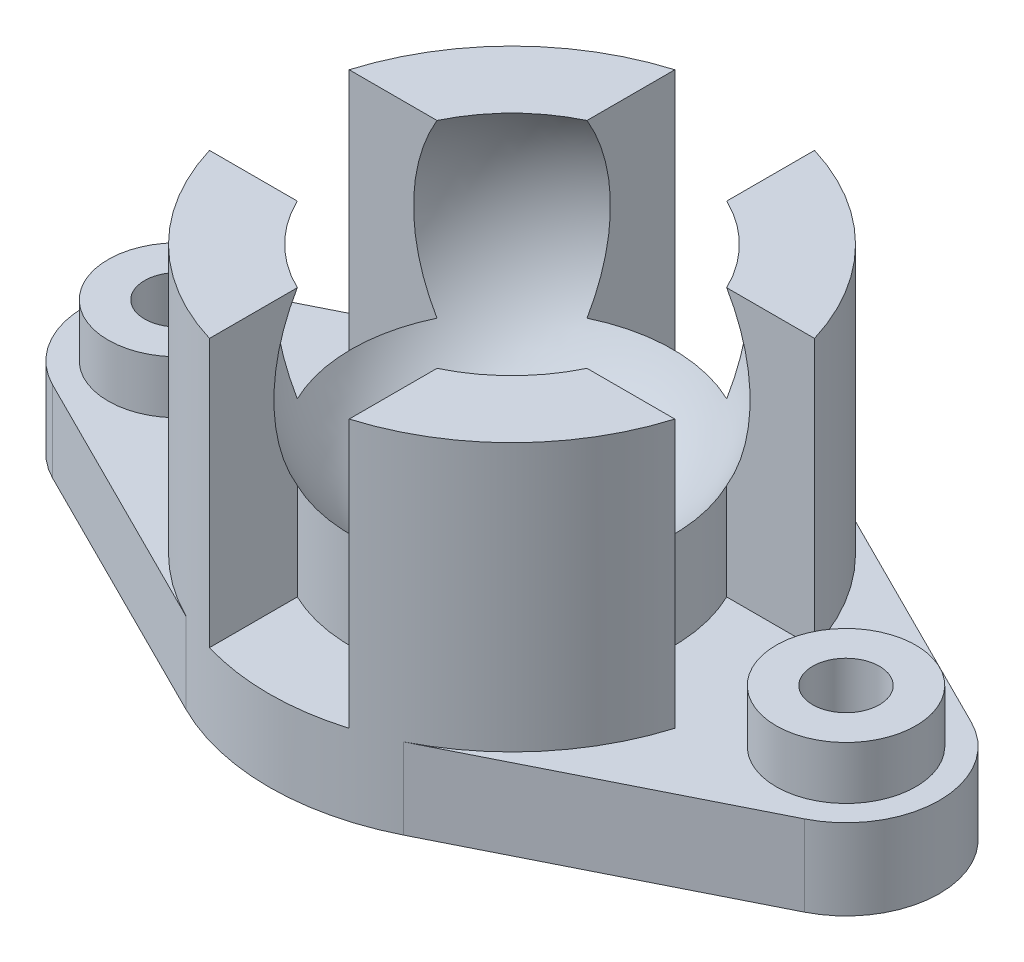
ISO-10303-21;
HEADER;
FILE_DESCRIPTION(('STEP AP214'),'2;1');
FILE_NAME('part.step','',(''),(''),'','','');
FILE_SCHEMA(('AUTOMOTIVE_DESIGN { 1 0 10303 214 1 1 1 1 }'));
ENDSEC;
DATA;
#1=APPLICATION_CONTEXT('core data for automotive mechanical design processes');
#2=APPLICATION_PROTOCOL_DEFINITION('international standard','automotive_design',2000,#1);
#3=PRODUCT_CONTEXT('',#1,'mechanical');
#4=PRODUCT('Part','Part','',(#3));
#5=PRODUCT_RELATED_PRODUCT_CATEGORY('part','',(#4));
#6=PRODUCT_DEFINITION_FORMATION('','',#4);
#7=PRODUCT_DEFINITION_CONTEXT('part definition',#1,'design');
#8=PRODUCT_DEFINITION('design','',#6,#7);
#9=PRODUCT_DEFINITION_SHAPE('','',#8);
#10=(LENGTH_UNIT() NAMED_UNIT(*) SI_UNIT(.MILLI.,.METRE.));
#11=(NAMED_UNIT(*) PLANE_ANGLE_UNIT() SI_UNIT($,.RADIAN.));
#12=(NAMED_UNIT(*) SI_UNIT($,.STERADIAN.) SOLID_ANGLE_UNIT());
#13=UNCERTAINTY_MEASURE_WITH_UNIT(LENGTH_MEASURE(1.E-05),#10,'distance_accuracy_value','');
#14=(GEOMETRIC_REPRESENTATION_CONTEXT(3) GLOBAL_UNCERTAINTY_ASSIGNED_CONTEXT((#13)) GLOBAL_UNIT_ASSIGNED_CONTEXT((#10,
#11,#12)) REPRESENTATION_CONTEXT('',''));
#15=CARTESIAN_POINT('',(0.,0.,0.));
#16=DIRECTION('',(0.,0.,1.));
#17=DIRECTION('',(1.,0.,0.));
#18=AXIS2_PLACEMENT_3D('',#15,#16,#17);
#19=CARTESIAN_POINT('',(0.,2.66,0.));
#20=DIRECTION('',(0.,-1.,0.));
#21=DIRECTION('',(0.,0.,-1.));
#22=AXIS2_PLACEMENT_3D('',#19,#20,#21);
#23=CYLINDRICAL_SURFACE('',#22,8.);
#24=DIRECTION('',(0.,1.,0.));
#25=VECTOR('',#24,1.);
#26=CARTESIAN_POINT('',(2.3,2.66,-7.66224510179621));
#27=LINE('',#26,#25);
#28=CARTESIAN_POINT('',(2.3,2.66,-7.66224510179621));
#29=VERTEX_POINT('',#28);
#30=CARTESIAN_POINT('',(2.3,11.48,-7.66224510179621));
#31=VERTEX_POINT('',#30);
#32=EDGE_CURVE('E231',#29,#31,#27,.T.);
#33=ORIENTED_EDGE('',*,*,#32,.T.);
#34=CARTESIAN_POINT('',(0.,11.48,0.));
#35=DIRECTION('',(0.,1.,0.));
#36=DIRECTION('',(0.,0.,1.));
#37=AXIS2_PLACEMENT_3D('',#34,#35,#36);
#38=CIRCLE('',#37,8.);
#39=CARTESIAN_POINT('',(7.66224510179621,11.48,-2.3));
#40=VERTEX_POINT('',#39);
#41=EDGE_CURVE('E388',#40,#31,#38,.T.);
#42=ORIENTED_EDGE('',*,*,#41,.F.);
#43=DIRECTION('',(0.,1.,0.));
#44=VECTOR('',#43,1.);
#45=CARTESIAN_POINT('',(7.66224510179621,2.66,-2.3));
#46=LINE('',#45,#44);
#47=CARTESIAN_POINT('',(7.66224510179621,2.66,-2.3));
#48=VERTEX_POINT('',#47);
#49=EDGE_CURVE('E311',#48,#40,#46,.T.);
#50=ORIENTED_EDGE('',*,*,#49,.F.);
#51=CARTESIAN_POINT('',(0.,2.66,0.));
#52=DIRECTION('',(0.,1.,0.));
#53=DIRECTION('',(0.,0.,1.));
#54=AXIS2_PLACEMENT_3D('',#51,#52,#53);
#55=CIRCLE('',#54,8.);
#56=CARTESIAN_POINT('',(3.58029256966229,2.66,-7.15412504193357));
#57=VERTEX_POINT('',#56);
#58=EDGE_CURVE('E390',#57,#48,#55,.F.);
#59=ORIENTED_EDGE('',*,*,#58,.F.);
#60=DIRECTION('',(0.,-1.,0.));
#61=VECTOR('',#60,1.);
#62=CARTESIAN_POINT('',(3.58029256966229,2.66,-7.15412504193357));
#63=LINE('',#62,#61);
#64=CARTESIAN_POINT('',(3.58029256966229,0.,-7.15412504193357));
#65=VERTEX_POINT('',#64);
#66=EDGE_CURVE('E464',#57,#65,#63,.T.);
#67=ORIENTED_EDGE('',*,*,#66,.T.);
#68=CARTESIAN_POINT('',(0.,0.,0.));
#69=DIRECTION('',(0.,1.,0.));
#70=DIRECTION('',(0.,0.,1.));
#71=AXIS2_PLACEMENT_3D('',#68,#69,#70);
#72=CIRCLE('',#71,8.);
#73=CARTESIAN_POINT('',(-3.58029256966229,0.,-7.15412504193357));
#74=VERTEX_POINT('',#73);
#75=EDGE_CURVE('E420',#65,#74,#72,.T.);
#76=ORIENTED_EDGE('',*,*,#75,.T.);
#77=DIRECTION('',(0.,-1.,0.));
#78=VECTOR('',#77,1.);
#79=CARTESIAN_POINT('',(-3.58029256966229,2.66,-7.15412504193357));
#80=LINE('',#79,#78);
#81=CARTESIAN_POINT('',(-3.58029256966229,2.66,-7.15412504193357));
#82=VERTEX_POINT('',#81);
#83=EDGE_CURVE('E437',#82,#74,#80,.T.);
#84=ORIENTED_EDGE('',*,*,#83,.F.);
#85=CARTESIAN_POINT('',(-7.66224510179621,2.66,-2.3));
#86=VERTEX_POINT('',#85);
#87=EDGE_CURVE('E394',#86,#82,#55,.F.);
#88=ORIENTED_EDGE('',*,*,#87,.F.);
#89=DIRECTION('',(0.,1.,0.));
#90=VECTOR('',#89,1.);
#91=CARTESIAN_POINT('',(-7.66224510179621,2.66,-2.3));
#92=LINE('',#91,#90);
#93=CARTESIAN_POINT('',(-7.66224510179621,11.48,-2.3));
#94=VERTEX_POINT('',#93);
#95=EDGE_CURVE('E373',#86,#94,#92,.T.);
#96=ORIENTED_EDGE('',*,*,#95,.T.);
#97=CARTESIAN_POINT('',(-2.3,11.48,-7.66224510179621));
#98=VERTEX_POINT('',#97);
#99=EDGE_CURVE('E579',#98,#94,#38,.T.);
#100=ORIENTED_EDGE('',*,*,#99,.F.);
#101=DIRECTION('',(0.,1.,0.));
#102=VECTOR('',#101,1.);
#103=CARTESIAN_POINT('',(-2.3,2.66,-7.66224510179621));
#104=LINE('',#103,#102);
#105=CARTESIAN_POINT('',(-2.3,2.66,-7.66224510179621));
#106=VERTEX_POINT('',#105);
#107=EDGE_CURVE('E244',#106,#98,#104,.T.);
#108=ORIENTED_EDGE('',*,*,#107,.F.);
#109=CARTESIAN_POINT('',(0.,2.66,0.));
#110=DIRECTION('',(0.,1.,0.));
#111=DIRECTION('',(0.,0.,1.));
#112=AXIS2_PLACEMENT_3D('',#109,#110,#111);
#113=CIRCLE('',#112,8.);
#114=EDGE_CURVE('E252',#29,#106,#113,.T.);
#115=ORIENTED_EDGE('',*,*,#114,.F.);
#116=EDGE_LOOP('',(#33,#42,#50,#59,#67,#76,#84,#88,#96,#100,#108,#115));
#117=FACE_BOUND('',#116,.T.);
#118=ADVANCED_FACE('F46',(#117),#23,.T.);
#119=DIRECTION('',(0.,1.,0.));
#120=VECTOR('',#119,1.);
#121=CARTESIAN_POINT('',(7.66224510179621,2.66,2.3));
#122=LINE('',#121,#120);
#123=CARTESIAN_POINT('',(7.66224510179621,2.66,2.3));
#124=VERTEX_POINT('',#123);
#125=CARTESIAN_POINT('',(7.66224510179621,11.48,2.3));
#126=VERTEX_POINT('',#125);
#127=EDGE_CURVE('E295',#124,#126,#122,.T.);
#128=ORIENTED_EDGE('',*,*,#127,.T.);
#129=CARTESIAN_POINT('',(2.3,11.48,7.66224510179621));
#130=VERTEX_POINT('',#129);
#131=EDGE_CURVE('E383',#130,#126,#38,.T.);
#132=ORIENTED_EDGE('',*,*,#131,.F.);
#133=DIRECTION('',(0.,1.,0.));
#134=VECTOR('',#133,1.);
#135=CARTESIAN_POINT('',(2.3,2.66,7.66224510179621));
#136=LINE('',#135,#134);
#137=CARTESIAN_POINT('',(2.3,2.66,7.66224510179621));
#138=VERTEX_POINT('',#137);
#139=EDGE_CURVE('E346',#138,#130,#136,.T.);
#140=ORIENTED_EDGE('',*,*,#139,.F.);
#141=CARTESIAN_POINT('',(0.,2.66,0.));
#142=DIRECTION('',(0.,1.,0.));
#143=DIRECTION('',(0.,0.,1.));
#144=AXIS2_PLACEMENT_3D('',#141,#142,#143);
#145=CIRCLE('',#144,8.);
#146=CARTESIAN_POINT('',(-2.3,2.66,7.66224510179621));
#147=VERTEX_POINT('',#146);
#148=EDGE_CURVE('E320',#147,#138,#145,.T.);
#149=ORIENTED_EDGE('',*,*,#148,.F.);
#150=DIRECTION('',(0.,1.,0.));
#151=VECTOR('',#150,1.);
#152=CARTESIAN_POINT('',(-2.3,2.66,7.66224510179621));
#153=LINE('',#152,#151);
#154=CARTESIAN_POINT('',(-2.3,11.48,7.66224510179621));
#155=VERTEX_POINT('',#154);
#156=EDGE_CURVE('E331',#147,#155,#153,.T.);
#157=ORIENTED_EDGE('',*,*,#156,.T.);
#158=CARTESIAN_POINT('',(-7.66224510179621,11.48,2.3));
#159=VERTEX_POINT('',#158);
#160=EDGE_CURVE('E389',#159,#155,#38,.T.);
#161=ORIENTED_EDGE('',*,*,#160,.F.);
#162=DIRECTION('',(0.,1.,0.));
#163=VECTOR('',#162,1.);
#164=CARTESIAN_POINT('',(-7.66224510179621,2.66,2.3));
#165=LINE('',#164,#163);
#166=CARTESIAN_POINT('',(-7.66224510179621,2.66,2.3));
#167=VERTEX_POINT('',#166);
#168=EDGE_CURVE('E336',#167,#159,#165,.T.);
#169=ORIENTED_EDGE('',*,*,#168,.F.);
#170=CARTESIAN_POINT('',(-3.58029256966229,2.66,7.15412504193357));
#171=VERTEX_POINT('',#170);
#172=EDGE_CURVE('E395',#171,#167,#55,.F.);
#173=ORIENTED_EDGE('',*,*,#172,.F.);
#174=DIRECTION('',(0.,-1.,0.));
#175=VECTOR('',#174,1.);
#176=CARTESIAN_POINT('',(-3.58029256966229,2.66,7.15412504193357));
#177=LINE('',#176,#175);
#178=CARTESIAN_POINT('',(-3.58029256966229,0.,7.15412504193357));
#179=VERTEX_POINT('',#178);
#180=EDGE_CURVE('E477',#171,#179,#177,.T.);
#181=ORIENTED_EDGE('',*,*,#180,.T.);
#182=CARTESIAN_POINT('',(3.58029256966229,0.,7.15412504193357));
#183=VERTEX_POINT('',#182);
#184=EDGE_CURVE('E447',#179,#183,#72,.T.);
#185=ORIENTED_EDGE('',*,*,#184,.T.);
#186=DIRECTION('',(0.,-1.,0.));
#187=VECTOR('',#186,1.);
#188=CARTESIAN_POINT('',(3.58029256966229,2.66,7.15412504193357));
#189=LINE('',#188,#187);
#190=CARTESIAN_POINT('',(3.58029256966229,2.66,7.15412504193357));
#191=VERTEX_POINT('',#190);
#192=EDGE_CURVE('E474',#191,#183,#189,.T.);
#193=ORIENTED_EDGE('',*,*,#192,.F.);
#194=EDGE_CURVE('E387',#124,#191,#55,.F.);
#195=ORIENTED_EDGE('',*,*,#194,.F.);
#196=EDGE_LOOP('',(#128,#132,#140,#149,#157,#161,#169,#173,#181,#185,#193,#195));
#197=FACE_BOUND('',#196,.T.);
#198=ADVANCED_FACE('F559',(#197),#23,.T.);
#199=CARTESIAN_POINT('',(0.,11.48,0.));
#200=DIRECTION('',(0.,1.,0.));
#201=DIRECTION('',(0.,0.,1.));
#202=AXIS2_PLACEMENT_3D('',#199,#200,#201);
#203=PLANE('',#202);
#204=ORIENTED_EDGE('',*,*,#41,.T.);
#205=DIRECTION('',(0.,0.,1.));
#206=VECTOR('',#205,1.);
#207=CARTESIAN_POINT('',(2.3,11.48,0.));
#208=LINE('',#207,#206);
#209=CARTESIAN_POINT('',(2.3,11.48,-4.77049263703446));
#210=VERTEX_POINT('',#209);
#211=EDGE_CURVE('E238',#31,#210,#208,.T.);
#212=ORIENTED_EDGE('',*,*,#211,.T.);
#213=CARTESIAN_POINT('',(0.,11.48,0.));
#214=DIRECTION('',(0.,1.,0.));
#215=DIRECTION('',(0.,0.,1.));
#216=AXIS2_PLACEMENT_3D('',#213,#214,#215);
#217=CIRCLE('',#216,5.29599848942576);
#218=CARTESIAN_POINT('',(4.77049263703446,11.48,-2.3));
#219=VERTEX_POINT('',#218);
#220=EDGE_CURVE('E534',#210,#219,#217,.F.);
#221=ORIENTED_EDGE('',*,*,#220,.T.);
#222=DIRECTION('',(1.,0.,0.));
#223=VECTOR('',#222,1.);
#224=CARTESIAN_POINT('',(0.,11.48,-2.3));
#225=LINE('',#224,#223);
#226=EDGE_CURVE('E288',#219,#40,#225,.T.);
#227=ORIENTED_EDGE('',*,*,#226,.T.);
#228=EDGE_LOOP('',(#204,#212,#221,#227));
#229=FACE_BOUND('',#228,.T.);
#230=ADVANCED_FACE('F576',(#229),#203,.T.);
#231=CARTESIAN_POINT('',(-4.77049263703446,11.48,-2.3));
#232=VERTEX_POINT('',#231);
#233=CARTESIAN_POINT('',(-2.3,11.48,-4.77049263703446));
#234=VERTEX_POINT('',#233);
#235=EDGE_CURVE('E491',#232,#234,#217,.F.);
#236=ORIENTED_EDGE('',*,*,#235,.T.);
#237=DIRECTION('',(0.,0.,-1.));
#238=VECTOR('',#237,1.);
#239=CARTESIAN_POINT('',(-2.3,11.48,0.));
#240=LINE('',#239,#238);
#241=EDGE_CURVE('E256',#234,#98,#240,.T.);
#242=ORIENTED_EDGE('',*,*,#241,.T.);
#243=ORIENTED_EDGE('',*,*,#99,.T.);
#244=DIRECTION('',(1.,0.,0.));
#245=VECTOR('',#244,1.);
#246=CARTESIAN_POINT('',(0.,11.48,-2.3));
#247=LINE('',#246,#245);
#248=EDGE_CURVE('E356',#94,#232,#247,.T.);
#249=ORIENTED_EDGE('',*,*,#248,.T.);
#250=EDGE_LOOP('',(#236,#242,#243,#249));
#251=FACE_BOUND('',#250,.T.);
#252=ADVANCED_FACE('F606',(#251),#203,.T.);
#253=ORIENTED_EDGE('',*,*,#131,.T.);
#254=DIRECTION('',(-1.,0.,0.));
#255=VECTOR('',#254,1.);
#256=CARTESIAN_POINT('',(0.,11.48,2.3));
#257=LINE('',#256,#255);
#258=CARTESIAN_POINT('',(4.77049263703446,11.48,2.3));
#259=VERTEX_POINT('',#258);
#260=EDGE_CURVE('E296',#126,#259,#257,.T.);
#261=ORIENTED_EDGE('',*,*,#260,.T.);
#262=CARTESIAN_POINT('',(2.3,11.48,4.77049263703446));
#263=VERTEX_POINT('',#262);
#264=EDGE_CURVE('E277',#259,#263,#217,.F.);
#265=ORIENTED_EDGE('',*,*,#264,.T.);
#266=DIRECTION('',(0.,0.,1.));
#267=VECTOR('',#266,1.);
#268=CARTESIAN_POINT('',(2.3,11.48,0.));
#269=LINE('',#268,#267);
#270=EDGE_CURVE('E70',#263,#130,#269,.T.);
#271=ORIENTED_EDGE('',*,*,#270,.T.);
#272=EDGE_LOOP('',(#253,#261,#265,#271));
#273=FACE_BOUND('',#272,.T.);
#274=ADVANCED_FACE('F544',(#273),#203,.T.);
#275=ORIENTED_EDGE('',*,*,#160,.T.);
#276=DIRECTION('',(0.,0.,-1.));
#277=VECTOR('',#276,1.);
#278=CARTESIAN_POINT('',(-2.3,11.48,0.));
#279=LINE('',#278,#277);
#280=CARTESIAN_POINT('',(-2.3,11.48,4.77049263703446));
#281=VERTEX_POINT('',#280);
#282=EDGE_CURVE('E332',#155,#281,#279,.T.);
#283=ORIENTED_EDGE('',*,*,#282,.T.);
#284=CARTESIAN_POINT('',(-4.77049263703446,11.48,2.3));
#285=VERTEX_POINT('',#284);
#286=EDGE_CURVE('E487',#281,#285,#217,.F.);
#287=ORIENTED_EDGE('',*,*,#286,.T.);
#288=DIRECTION('',(-1.,0.,0.));
#289=VECTOR('',#288,1.);
#290=CARTESIAN_POINT('',(0.,11.48,2.3));
#291=LINE('',#290,#289);
#292=EDGE_CURVE('E363',#285,#159,#291,.T.);
#293=ORIENTED_EDGE('',*,*,#292,.T.);
#294=EDGE_LOOP('',(#275,#283,#287,#293));
#295=FACE_BOUND('',#294,.T.);
#296=ADVANCED_FACE('F587',(#295),#203,.T.);
#297=CARTESIAN_POINT('',(0.,8.66,0.));
#298=DIRECTION('',(0.,-1.,0.));
#299=DIRECTION('',(-1.,0.,0.));
#300=AXIS2_PLACEMENT_3D('',#297,#298,#299);
#301=SPHERICAL_SURFACE('',#300,6.);
#302=ORIENTED_EDGE('',*,*,#220,.F.);
#303=CARTESIAN_POINT('',(2.3,8.66,0.));
#304=DIRECTION('',(-1.,0.,0.));
#305=DIRECTION('',(0.,0.,1.));
#306=AXIS2_PLACEMENT_3D('',#303,#304,#305);
#307=CIRCLE('',#306,5.54166040099896);
#308=CARTESIAN_POINT('',(2.3,5.83999999999999,-4.77049263703446));
#309=VERTEX_POINT('',#308);
#310=EDGE_CURVE('E12',#210,#309,#307,.T.);
#311=ORIENTED_EDGE('',*,*,#310,.T.);
#312=CARTESIAN_POINT('',(0.,5.83999999999999,0.));
#313=DIRECTION('',(0.,1.,0.));
#314=DIRECTION('',(0.,0.,1.));
#315=AXIS2_PLACEMENT_3D('',#312,#313,#314);
#316=CIRCLE('',#315,5.29599848942576);
#317=CARTESIAN_POINT('',(-2.3,5.83999999999999,-4.77049263703446));
#318=VERTEX_POINT('',#317);
#319=EDGE_CURVE('E55',#318,#309,#316,.F.);
#320=ORIENTED_EDGE('',*,*,#319,.F.);
#321=CARTESIAN_POINT('',(-2.3,8.66,0.));
#322=DIRECTION('',(1.,0.,0.));
#323=DIRECTION('',(0.,0.,-1.));
#324=AXIS2_PLACEMENT_3D('',#321,#322,#323);
#325=CIRCLE('',#324,5.54166040099896);
#326=EDGE_CURVE('E523',#318,#234,#325,.T.);
#327=ORIENTED_EDGE('',*,*,#326,.T.);
#328=ORIENTED_EDGE('',*,*,#235,.F.);
#329=CARTESIAN_POINT('',(0.,8.66,-2.3));
#330=DIRECTION('',(0.,0.,1.));
#331=DIRECTION('',(1.,0.,0.));
#332=AXIS2_PLACEMENT_3D('',#329,#330,#331);
#333=CIRCLE('',#332,5.54166040099896);
#334=CARTESIAN_POINT('',(-4.77049263703446,5.83999999999999,-2.3));
#335=VERTEX_POINT('',#334);
#336=EDGE_CURVE('E494',#232,#335,#333,.T.);
#337=ORIENTED_EDGE('',*,*,#336,.T.);
#338=CARTESIAN_POINT('',(0.,5.83999999999999,0.));
#339=DIRECTION('',(0.,1.,0.));
#340=DIRECTION('',(0.,0.,1.));
#341=AXIS2_PLACEMENT_3D('',#338,#339,#340);
#342=CIRCLE('',#341,5.29599848942576);
#343=CARTESIAN_POINT('',(-4.77049263703446,5.83999999999999,2.3));
#344=VERTEX_POINT('',#343);
#345=EDGE_CURVE('E409',#344,#335,#342,.F.);
#346=ORIENTED_EDGE('',*,*,#345,.F.);
#347=CARTESIAN_POINT('',(0.,8.66,2.3));
#348=DIRECTION('',(0.,0.,-1.));
#349=DIRECTION('',(-1.,0.,0.));
#350=AXIS2_PLACEMENT_3D('',#347,#348,#349);
#351=CIRCLE('',#350,5.54166040099896);
#352=EDGE_CURVE('E498',#344,#285,#351,.T.);
#353=ORIENTED_EDGE('',*,*,#352,.T.);
#354=ORIENTED_EDGE('',*,*,#286,.F.);
#355=CARTESIAN_POINT('',(-2.3,8.66,0.));
#356=DIRECTION('',(1.,0.,0.));
#357=DIRECTION('',(0.,0.,-1.));
#358=AXIS2_PLACEMENT_3D('',#355,#356,#357);
#359=CIRCLE('',#358,5.54166040099896);
#360=CARTESIAN_POINT('',(-2.3,5.83999999999999,4.77049263703446));
#361=VERTEX_POINT('',#360);
#362=EDGE_CURVE('E508',#281,#361,#359,.T.);
#363=ORIENTED_EDGE('',*,*,#362,.T.);
#364=CARTESIAN_POINT('',(0.,5.83999999999999,0.));
#365=DIRECTION('',(0.,1.,0.));
#366=DIRECTION('',(0.,0.,1.));
#367=AXIS2_PLACEMENT_3D('',#364,#365,#366);
#368=CIRCLE('',#367,5.29599848942576);
#369=CARTESIAN_POINT('',(2.3,5.84,4.77049263703446));
#370=VERTEX_POINT('',#369);
#371=EDGE_CURVE('E505',#370,#361,#368,.F.);
#372=ORIENTED_EDGE('',*,*,#371,.F.);
#373=CARTESIAN_POINT('',(2.3,8.66,0.));
#374=DIRECTION('',(-1.,0.,0.));
#375=DIRECTION('',(0.,0.,1.));
#376=AXIS2_PLACEMENT_3D('',#373,#374,#375);
#377=CIRCLE('',#376,5.54166040099896);
#378=EDGE_CURVE('E502',#370,#263,#377,.T.);
#379=ORIENTED_EDGE('',*,*,#378,.T.);
#380=ORIENTED_EDGE('',*,*,#264,.F.);
#381=CARTESIAN_POINT('',(0.,8.66,2.3));
#382=DIRECTION('',(0.,0.,-1.));
#383=DIRECTION('',(-1.,0.,0.));
#384=AXIS2_PLACEMENT_3D('',#381,#382,#383);
#385=CIRCLE('',#384,5.54166040099896);
#386=CARTESIAN_POINT('',(4.77049263703446,5.83999999999999,2.3));
#387=VERTEX_POINT('',#386);
#388=EDGE_CURVE('E519',#259,#387,#385,.T.);
#389=ORIENTED_EDGE('',*,*,#388,.T.);
#390=CARTESIAN_POINT('',(0.,5.83999999999999,0.));
#391=DIRECTION('',(0.,1.,0.));
#392=DIRECTION('',(0.,0.,1.));
#393=AXIS2_PLACEMENT_3D('',#390,#391,#392);
#394=CIRCLE('',#393,5.29599848942576);
#395=CARTESIAN_POINT('',(4.77049263703446,5.83999999999999,-2.3));
#396=VERTEX_POINT('',#395);
#397=EDGE_CURVE('E516',#396,#387,#394,.F.);
#398=ORIENTED_EDGE('',*,*,#397,.F.);
#399=CARTESIAN_POINT('',(0.,8.66,-2.3));
#400=DIRECTION('',(0.,0.,1.));
#401=DIRECTION('',(1.,0.,0.));
#402=AXIS2_PLACEMENT_3D('',#399,#400,#401);
#403=CIRCLE('',#402,5.54166040099896);
#404=EDGE_CURVE('E512',#396,#219,#403,.T.);
#405=ORIENTED_EDGE('',*,*,#404,.T.);
#406=EDGE_LOOP('',(#302,#311,#320,#327,#328,#337,#346,#353,#354,#363,#372,#379,#380,#389,#398,#405));
#407=FACE_BOUND('',#406,.T.);
#408=ADVANCED_FACE('F532',(#407),#301,.F.);
#409=CARTESIAN_POINT('',(0.,2.66,0.));
#410=DIRECTION('',(0.,1.,0.));
#411=DIRECTION('',(0.,0.,1.));
#412=AXIS2_PLACEMENT_3D('',#409,#410,#411);
#413=PLANE('',#412);
#414=CARTESIAN_POINT('',(-11.,2.66,0.));
#415=DIRECTION('',(0.,1.,0.));
#416=DIRECTION('',(0.,0.,1.));
#417=AXIS2_PLACEMENT_3D('',#414,#415,#416);
#418=CIRCLE('',#417,2.3);
#419=CARTESIAN_POINT('',(-11.,2.66,2.3));
#420=VERTEX_POINT('',#419);
#421=EDGE_CURVE('E400',#420,#420,#418,.F.);
#422=ORIENTED_EDGE('',*,*,#421,.T.);
#423=EDGE_LOOP('',(#422));
#424=FACE_BOUND('',#423,.T.);
#425=DIRECTION('',(0.894265630241696,0.,0.447536571207786));
#426=VECTOR('',#425,1.);
#427=CARTESIAN_POINT('',(-3.58029256966229,2.66,7.15412504193357));
#428=LINE('',#427,#426);
#429=CARTESIAN_POINT('',(-12.3771137614096,2.66,2.75174272895284));
#430=VERTEX_POINT('',#429);
#431=EDGE_CURVE('E423',#430,#171,#428,.T.);
#432=ORIENTED_EDGE('',*,*,#431,.T.);
#433=ORIENTED_EDGE('',*,*,#172,.T.);
#434=DIRECTION('',(-1.,0.,0.));
#435=VECTOR('',#434,1.);
#436=CARTESIAN_POINT('',(0.,2.66,2.3));
#437=LINE('',#436,#435);
#438=CARTESIAN_POINT('',(-4.77049263703446,2.66,2.3));
#439=VERTEX_POINT('',#438);
#440=EDGE_CURVE('E352',#439,#167,#437,.T.);
#441=ORIENTED_EDGE('',*,*,#440,.F.);
#442=CARTESIAN_POINT('',(0.,2.66,0.));
#443=DIRECTION('',(0.,1.,0.));
#444=DIRECTION('',(0.,0.,1.));
#445=AXIS2_PLACEMENT_3D('',#442,#443,#444);
#446=CIRCLE('',#445,5.29599848942576);
#447=CARTESIAN_POINT('',(-4.77049263703446,2.66,-2.3));
#448=VERTEX_POINT('',#447);
#449=EDGE_CURVE('E355',#439,#448,#446,.F.);
#450=ORIENTED_EDGE('',*,*,#449,.T.);
#451=DIRECTION('',(1.,0.,0.));
#452=VECTOR('',#451,1.);
#453=CARTESIAN_POINT('',(0.,2.66,-2.3));
#454=LINE('',#453,#452);
#455=EDGE_CURVE('E360',#86,#448,#454,.T.);
#456=ORIENTED_EDGE('',*,*,#455,.F.);
#457=ORIENTED_EDGE('',*,*,#87,.T.);
#458=DIRECTION('',(0.894265630241696,0.,-0.447536571207786));
#459=VECTOR('',#458,1.);
#460=CARTESIAN_POINT('',(-3.58029256966229,2.66,-7.15412504193357));
#461=LINE('',#460,#459);
#462=CARTESIAN_POINT('',(-12.3771137614096,2.66,-2.75174272895284));
#463=VERTEX_POINT('',#462);
#464=EDGE_CURVE('E415',#463,#82,#461,.T.);
#465=ORIENTED_EDGE('',*,*,#464,.F.);
#466=CARTESIAN_POINT('',(-11.,2.66,0.));
#467=DIRECTION('',(0.,1.,0.));
#468=DIRECTION('',(0.,0.,1.));
#469=AXIS2_PLACEMENT_3D('',#466,#467,#468);
#470=CIRCLE('',#469,3.07709771671435);
#471=EDGE_CURVE('E419',#463,#430,#470,.T.);
#472=ORIENTED_EDGE('',*,*,#471,.T.);
#473=EDGE_LOOP('',(#432,#433,#441,#450,#456,#457,#465,#472));
#474=FACE_BOUND('',#473,.T.);
#475=ADVANCED_FACE('F599',(#424,#474),#413,.T.);
#476=CARTESIAN_POINT('',(11.,2.66,0.));
#477=DIRECTION('',(0.,1.,0.));
#478=DIRECTION('',(0.,0.,1.));
#479=AXIS2_PLACEMENT_3D('',#476,#477,#478);
#480=CIRCLE('',#479,2.3);
#481=CARTESIAN_POINT('',(11.,2.66,2.3));
#482=VERTEX_POINT('',#481);
#483=EDGE_CURVE('E405',#482,#482,#480,.T.);
#484=ORIENTED_EDGE('',*,*,#483,.F.);
#485=EDGE_LOOP('',(#484));
#486=FACE_BOUND('',#485,.T.);
#487=DIRECTION('',(-0.894265630241696,0.,-0.447536571207786));
#488=VECTOR('',#487,1.);
#489=CARTESIAN_POINT('',(3.58029256966229,2.66,-7.15412504193357));
#490=LINE('',#489,#488);
#491=CARTESIAN_POINT('',(12.3771137614096,2.66,-2.75174272895284));
#492=VERTEX_POINT('',#491);
#493=EDGE_CURVE('E434',#492,#57,#490,.T.);
#494=ORIENTED_EDGE('',*,*,#493,.T.);
#495=ORIENTED_EDGE('',*,*,#58,.T.);
#496=DIRECTION('',(1.,0.,0.));
#497=VECTOR('',#496,1.);
#498=CARTESIAN_POINT('',(0.,2.66,-2.3));
#499=LINE('',#498,#497);
#500=CARTESIAN_POINT('',(4.77049263703446,2.66,-2.3));
#501=VERTEX_POINT('',#500);
#502=EDGE_CURVE('E287',#501,#48,#499,.T.);
#503=ORIENTED_EDGE('',*,*,#502,.F.);
#504=CARTESIAN_POINT('',(0.,2.66,0.));
#505=DIRECTION('',(0.,1.,0.));
#506=DIRECTION('',(0.,0.,1.));
#507=AXIS2_PLACEMENT_3D('',#504,#505,#506);
#508=CIRCLE('',#507,5.29599848942576);
#509=CARTESIAN_POINT('',(4.77049263703446,2.66,2.3));
#510=VERTEX_POINT('',#509);
#511=EDGE_CURVE('E291',#501,#510,#508,.F.);
#512=ORIENTED_EDGE('',*,*,#511,.T.);
#513=DIRECTION('',(-1.,0.,0.));
#514=VECTOR('',#513,1.);
#515=CARTESIAN_POINT('',(0.,2.66,2.3));
#516=LINE('',#515,#514);
#517=EDGE_CURVE('E284',#124,#510,#516,.T.);
#518=ORIENTED_EDGE('',*,*,#517,.F.);
#519=ORIENTED_EDGE('',*,*,#194,.T.);
#520=DIRECTION('',(-0.894265630241696,0.,0.447536571207786));
#521=VECTOR('',#520,1.);
#522=CARTESIAN_POINT('',(3.58029256966229,2.66,7.15412504193357));
#523=LINE('',#522,#521);
#524=CARTESIAN_POINT('',(12.3771137614096,2.66,2.75174272895284));
#525=VERTEX_POINT('',#524);
#526=EDGE_CURVE('E426',#525,#191,#523,.T.);
#527=ORIENTED_EDGE('',*,*,#526,.F.);
#528=CARTESIAN_POINT('',(11.,2.66,0.));
#529=DIRECTION('',(0.,1.,0.));
#530=DIRECTION('',(0.,0.,1.));
#531=AXIS2_PLACEMENT_3D('',#528,#529,#530);
#532=CIRCLE('',#531,3.07709771671435);
#533=EDGE_CURVE('E430',#492,#525,#532,.F.);
#534=ORIENTED_EDGE('',*,*,#533,.F.);
#535=EDGE_LOOP('',(#494,#495,#503,#512,#518,#519,#527,#534));
#536=FACE_BOUND('',#535,.T.);
#537=ADVANCED_FACE('F567',(#486,#536),#413,.T.);
#538=CARTESIAN_POINT('',(-3.58029256966229,2.66,-7.15412504193357));
#539=DIRECTION('',(-0.447536571207786,0.,-0.894265630241696));
#540=DIRECTION('',(-0.894265630241696,0.,0.447536571207786));
#541=AXIS2_PLACEMENT_3D('',#538,#539,#540);
#542=PLANE('',#541);
#543=DIRECTION('',(0.894265630241696,0.,-0.447536571207786));
#544=VECTOR('',#543,1.);
#545=CARTESIAN_POINT('',(-3.58029256966229,0.,-7.15412504193357));
#546=LINE('',#545,#544);
#547=CARTESIAN_POINT('',(-12.3771137614096,0.,-2.75174272895284));
#548=VERTEX_POINT('',#547);
#549=EDGE_CURVE('E414',#548,#74,#546,.T.);
#550=ORIENTED_EDGE('',*,*,#549,.F.);
#551=DIRECTION('',(0.,-1.,0.));
#552=VECTOR('',#551,1.);
#553=CARTESIAN_POINT('',(-12.3771137614096,2.66,-2.75174272895284));
#554=LINE('',#553,#552);
#555=EDGE_CURVE('E410',#463,#548,#554,.T.);
#556=ORIENTED_EDGE('',*,*,#555,.F.);
#557=ORIENTED_EDGE('',*,*,#464,.T.);
#558=ORIENTED_EDGE('',*,*,#83,.T.);
#559=EDGE_LOOP('',(#550,#556,#557,#558));
#560=FACE_BOUND('',#559,.T.);
#561=ADVANCED_FACE('F48',(#560),#542,.T.);
#562=CARTESIAN_POINT('',(-11.,2.66,0.));
#563=DIRECTION('',(0.,-1.,0.));
#564=DIRECTION('',(0.,0.,-1.));
#565=AXIS2_PLACEMENT_3D('',#562,#563,#564);
#566=CYLINDRICAL_SURFACE('',#565,3.07709771671435);
#567=CARTESIAN_POINT('',(-11.,0.,0.));
#568=DIRECTION('',(0.,1.,0.));
#569=DIRECTION('',(0.,0.,1.));
#570=AXIS2_PLACEMENT_3D('',#567,#568,#569);
#571=CIRCLE('',#570,3.07709771671435);
#572=CARTESIAN_POINT('',(-12.3771137614096,0.,2.75174272895284));
#573=VERTEX_POINT('',#572);
#574=EDGE_CURVE('E441',#548,#573,#571,.T.);
#575=ORIENTED_EDGE('',*,*,#574,.T.);
#576=DIRECTION('',(0.,-1.,0.));
#577=VECTOR('',#576,1.);
#578=CARTESIAN_POINT('',(-12.3771137614096,2.66,2.75174272895284));
#579=LINE('',#578,#577);
#580=EDGE_CURVE('E481',#430,#573,#579,.T.);
#581=ORIENTED_EDGE('',*,*,#580,.F.);
#582=ORIENTED_EDGE('',*,*,#471,.F.);
#583=ORIENTED_EDGE('',*,*,#555,.T.);
#584=EDGE_LOOP('',(#575,#581,#582,#583));
#585=FACE_BOUND('',#584,.T.);
#586=ADVANCED_FACE('F630',(#585),#566,.T.);
#587=CARTESIAN_POINT('',(-3.58029256966229,2.66,7.15412504193357));
#588=DIRECTION('',(0.447536571207786,0.,-0.894265630241696));
#589=DIRECTION('',(-0.894265630241696,0.,-0.447536571207786));
#590=AXIS2_PLACEMENT_3D('',#587,#588,#589);
#591=PLANE('',#590);
#592=DIRECTION('',(0.894265630241696,0.,0.447536571207786));
#593=VECTOR('',#592,1.);
#594=CARTESIAN_POINT('',(-3.58029256966229,0.,7.15412504193357));
#595=LINE('',#594,#593);
#596=EDGE_CURVE('E444',#573,#179,#595,.T.);
#597=ORIENTED_EDGE('',*,*,#596,.T.);
#598=ORIENTED_EDGE('',*,*,#180,.F.);
#599=ORIENTED_EDGE('',*,*,#431,.F.);
#600=ORIENTED_EDGE('',*,*,#580,.T.);
#601=EDGE_LOOP('',(#597,#598,#599,#600));
#602=FACE_BOUND('',#601,.T.);
#603=ADVANCED_FACE('F632',(#602),#591,.F.);
#604=CARTESIAN_POINT('',(3.58029256966229,2.66,7.15412504193357));
#605=DIRECTION('',(0.447536571207786,0.,0.894265630241696));
#606=DIRECTION('',(0.894265630241696,0.,-0.447536571207786));
#607=AXIS2_PLACEMENT_3D('',#604,#605,#606);
#608=PLANE('',#607);
#609=DIRECTION('',(-0.894265630241696,0.,0.447536571207786));
#610=VECTOR('',#609,1.);
#611=CARTESIAN_POINT('',(3.58029256966229,0.,7.15412504193357));
#612=LINE('',#611,#610);
#613=CARTESIAN_POINT('',(12.3771137614096,0.,2.75174272895284));
#614=VERTEX_POINT('',#613);
#615=EDGE_CURVE('E451',#614,#183,#612,.T.);
#616=ORIENTED_EDGE('',*,*,#615,.F.);
#617=DIRECTION('',(0.,-1.,0.));
#618=VECTOR('',#617,1.);
#619=CARTESIAN_POINT('',(12.3771137614096,2.66,2.75174272895284));
#620=LINE('',#619,#618);
#621=EDGE_CURVE('E471',#525,#614,#620,.T.);
#622=ORIENTED_EDGE('',*,*,#621,.F.);
#623=ORIENTED_EDGE('',*,*,#526,.T.);
#624=ORIENTED_EDGE('',*,*,#192,.T.);
#625=EDGE_LOOP('',(#616,#622,#623,#624));
#626=FACE_BOUND('',#625,.T.);
#627=ADVANCED_FACE('F636',(#626),#608,.T.);
#628=CARTESIAN_POINT('',(11.,2.66,0.));
#629=DIRECTION('',(0.,-1.,0.));
#630=DIRECTION('',(0.,0.,-1.));
#631=AXIS2_PLACEMENT_3D('',#628,#629,#630);
#632=CYLINDRICAL_SURFACE('',#631,3.07709771671435);
#633=CARTESIAN_POINT('',(11.,0.,0.));
#634=DIRECTION('',(0.,1.,0.));
#635=DIRECTION('',(0.,0.,1.));
#636=AXIS2_PLACEMENT_3D('',#633,#634,#635);
#637=CIRCLE('',#636,3.07709771671435);
#638=CARTESIAN_POINT('',(12.3771137614096,0.,-2.75174272895284));
#639=VERTEX_POINT('',#638);
#640=EDGE_CURVE('E455',#639,#614,#637,.F.);
#641=ORIENTED_EDGE('',*,*,#640,.F.);
#642=DIRECTION('',(0.,-1.,0.));
#643=VECTOR('',#642,1.);
#644=CARTESIAN_POINT('',(12.3771137614096,2.66,-2.75174272895284));
#645=LINE('',#644,#643);
#646=EDGE_CURVE('E468',#492,#639,#645,.T.);
#647=ORIENTED_EDGE('',*,*,#646,.F.);
#648=ORIENTED_EDGE('',*,*,#533,.T.);
#649=ORIENTED_EDGE('',*,*,#621,.T.);
#650=EDGE_LOOP('',(#641,#647,#648,#649));
#651=FACE_BOUND('',#650,.T.);
#652=ADVANCED_FACE('F639',(#651),#632,.T.);
#653=CARTESIAN_POINT('',(3.58029256966229,2.66,-7.15412504193357));
#654=DIRECTION('',(-0.447536571207786,0.,0.894265630241696));
#655=DIRECTION('',(0.894265630241696,0.,0.447536571207786));
#656=AXIS2_PLACEMENT_3D('',#653,#654,#655);
#657=PLANE('',#656);
#658=DIRECTION('',(-0.894265630241696,0.,-0.447536571207786));
#659=VECTOR('',#658,1.);
#660=CARTESIAN_POINT('',(3.58029256966229,0.,-7.15412504193357));
#661=LINE('',#660,#659);
#662=EDGE_CURVE('E459',#639,#65,#661,.T.);
#663=ORIENTED_EDGE('',*,*,#662,.T.);
#664=ORIENTED_EDGE('',*,*,#66,.F.);
#665=ORIENTED_EDGE('',*,*,#493,.F.);
#666=ORIENTED_EDGE('',*,*,#646,.T.);
#667=EDGE_LOOP('',(#663,#664,#665,#666));
#668=FACE_BOUND('',#667,.T.);
#669=ADVANCED_FACE('F642',(#668),#657,.F.);
#670=CARTESIAN_POINT('',(0.,0.,0.));
#671=DIRECTION('',(0.,1.,0.));
#672=DIRECTION('',(0.,0.,1.));
#673=AXIS2_PLACEMENT_3D('',#670,#671,#672);
#674=PLANE('',#673);
#675=CARTESIAN_POINT('',(11.,0.,0.));
#676=DIRECTION('',(0.,1.,0.));
#677=DIRECTION('',(0.,0.,1.));
#678=AXIS2_PLACEMENT_3D('',#675,#676,#677);
#679=CIRCLE('',#678,1.09999999999999);
#680=CARTESIAN_POINT('',(11.,0.,1.09999999999999));
#681=VERTEX_POINT('',#680);
#682=EDGE_CURVE('E724',#681,#681,#679,.T.);
#683=ORIENTED_EDGE('',*,*,#682,.T.);
#684=EDGE_LOOP('',(#683));
#685=FACE_BOUND('',#684,.T.);
#686=CARTESIAN_POINT('',(-11.,0.,0.));
#687=DIRECTION('',(0.,1.,0.));
#688=DIRECTION('',(0.,0.,1.));
#689=AXIS2_PLACEMENT_3D('',#686,#687,#688);
#690=CIRCLE('',#689,1.09999999999999);
#691=CARTESIAN_POINT('',(-11.,0.,1.09999999999999));
#692=VERTEX_POINT('',#691);
#693=EDGE_CURVE('E367',#692,#692,#690,.T.);
#694=ORIENTED_EDGE('',*,*,#693,.T.);
#695=EDGE_LOOP('',(#694));
#696=FACE_BOUND('',#695,.T.);
#697=ORIENTED_EDGE('',*,*,#184,.F.);
#698=ORIENTED_EDGE('',*,*,#596,.F.);
#699=ORIENTED_EDGE('',*,*,#574,.F.);
#700=ORIENTED_EDGE('',*,*,#549,.T.);
#701=ORIENTED_EDGE('',*,*,#75,.F.);
#702=ORIENTED_EDGE('',*,*,#662,.F.);
#703=ORIENTED_EDGE('',*,*,#640,.T.);
#704=ORIENTED_EDGE('',*,*,#615,.T.);
#705=EDGE_LOOP('',(#697,#698,#699,#700,#701,#702,#703,#704));
#706=FACE_BOUND('',#705,.T.);
#707=ADVANCED_FACE('F622',(#685,#696,#706),#674,.F.);
#708=CARTESIAN_POINT('',(11.,4.4,0.));
#709=DIRECTION('',(0.,-1.,0.));
#710=DIRECTION('',(0.,0.,-1.));
#711=AXIS2_PLACEMENT_3D('',#708,#709,#710);
#712=CYLINDRICAL_SURFACE('',#711,2.3);
#713=ORIENTED_EDGE('',*,*,#483,.T.);
#714=EDGE_LOOP('',(#713));
#715=FACE_BOUND('',#714,.T.);
#716=CARTESIAN_POINT('',(11.,4.4,0.));
#717=DIRECTION('',(0.,1.,0.));
#718=DIRECTION('',(0.,0.,1.));
#719=AXIS2_PLACEMENT_3D('',#716,#717,#718);
#720=CIRCLE('',#719,2.3);
#721=CARTESIAN_POINT('',(11.,4.4,2.3));
#722=VERTEX_POINT('',#721);
#723=EDGE_CURVE('E401',#722,#722,#720,.F.);
#724=ORIENTED_EDGE('',*,*,#723,.T.);
#725=EDGE_LOOP('',(#724));
#726=FACE_BOUND('',#725,.T.);
#727=ADVANCED_FACE('F650',(#715,#726),#712,.T.);
#728=CARTESIAN_POINT('',(0.,4.4,0.));
#729=DIRECTION('',(0.,1.,0.));
#730=DIRECTION('',(0.,0.,1.));
#731=AXIS2_PLACEMENT_3D('',#728,#729,#730);
#732=PLANE('',#731);
#733=CARTESIAN_POINT('',(11.,4.4,0.));
#734=DIRECTION('',(0.,1.,0.));
#735=DIRECTION('',(0.,0.,1.));
#736=AXIS2_PLACEMENT_3D('',#733,#734,#735);
#737=CIRCLE('',#736,1.09999999999999);
#738=CARTESIAN_POINT('',(11.,4.4,1.09999999999999));
#739=VERTEX_POINT('',#738);
#740=EDGE_CURVE('E727',#739,#739,#737,.T.);
#741=ORIENTED_EDGE('',*,*,#740,.F.);
#742=EDGE_LOOP('',(#741));
#743=FACE_BOUND('',#742,.T.);
#744=ORIENTED_EDGE('',*,*,#723,.F.);
#745=EDGE_LOOP('',(#744));
#746=FACE_BOUND('',#745,.T.);
#747=ADVANCED_FACE('F665',(#743,#746),#732,.T.);
#748=CARTESIAN_POINT('',(-11.,4.4,0.));
#749=DIRECTION('',(0.,-1.,0.));
#750=DIRECTION('',(0.,0.,-1.));
#751=AXIS2_PLACEMENT_3D('',#748,#749,#750);
#752=CYLINDRICAL_SURFACE('',#751,2.3);
#753=ORIENTED_EDGE('',*,*,#421,.F.);
#754=EDGE_LOOP('',(#753));
#755=FACE_BOUND('',#754,.T.);
#756=CARTESIAN_POINT('',(-11.,4.4,0.));
#757=DIRECTION('',(0.,1.,0.));
#758=DIRECTION('',(0.,0.,1.));
#759=AXIS2_PLACEMENT_3D('',#756,#757,#758);
#760=CIRCLE('',#759,2.3);
#761=CARTESIAN_POINT('',(-11.,4.4,2.3));
#762=VERTEX_POINT('',#761);
#763=EDGE_CURVE('E396',#762,#762,#760,.T.);
#764=ORIENTED_EDGE('',*,*,#763,.F.);
#765=EDGE_LOOP('',(#764));
#766=FACE_BOUND('',#765,.T.);
#767=ADVANCED_FACE('F669',(#755,#766),#752,.T.);
#768=CARTESIAN_POINT('',(0.,4.4,0.));
#769=DIRECTION('',(0.,1.,0.));
#770=DIRECTION('',(0.,0.,1.));
#771=AXIS2_PLACEMENT_3D('',#768,#769,#770);
#772=PLANE('',#771);
#773=CARTESIAN_POINT('',(-11.,4.4,0.));
#774=DIRECTION('',(0.,1.,0.));
#775=DIRECTION('',(0.,0.,1.));
#776=AXIS2_PLACEMENT_3D('',#773,#774,#775);
#777=CIRCLE('',#776,1.09999999999999);
#778=CARTESIAN_POINT('',(-11.,4.4,1.09999999999999));
#779=VERTEX_POINT('',#778);
#780=EDGE_CURVE('E731',#779,#779,#777,.T.);
#781=ORIENTED_EDGE('',*,*,#780,.F.);
#782=EDGE_LOOP('',(#781));
#783=FACE_BOUND('',#782,.T.);
#784=ORIENTED_EDGE('',*,*,#763,.T.);
#785=EDGE_LOOP('',(#784));
#786=FACE_BOUND('',#785,.T.);
#787=ADVANCED_FACE('F673',(#783,#786),#772,.T.);
#788=CARTESIAN_POINT('',(0.,2.66,2.3));
#789=DIRECTION('',(0.,0.,-1.));
#790=DIRECTION('',(-1.,0.,0.));
#791=AXIS2_PLACEMENT_3D('',#788,#789,#790);
#792=PLANE('',#791);
#793=DIRECTION('',(0.,1.,0.));
#794=VECTOR('',#793,1.);
#795=CARTESIAN_POINT('',(-4.77049263703446,2.66,2.3));
#796=LINE('',#795,#794);
#797=EDGE_CURVE('E62',#439,#344,#796,.T.);
#798=ORIENTED_EDGE('',*,*,#797,.F.);
#799=ORIENTED_EDGE('',*,*,#440,.T.);
#800=ORIENTED_EDGE('',*,*,#168,.T.);
#801=ORIENTED_EDGE('',*,*,#292,.F.);
#802=ORIENTED_EDGE('',*,*,#352,.F.);
#803=EDGE_LOOP('',(#798,#799,#800,#801,#802));
#804=FACE_BOUND('',#803,.T.);
#805=ADVANCED_FACE('F596',(#804),#792,.T.);
#806=CARTESIAN_POINT('',(0.,2.66,-2.3));
#807=DIRECTION('',(0.,0.,1.));
#808=DIRECTION('',(1.,0.,0.));
#809=AXIS2_PLACEMENT_3D('',#806,#807,#808);
#810=PLANE('',#809);
#811=ORIENTED_EDGE('',*,*,#248,.F.);
#812=ORIENTED_EDGE('',*,*,#95,.F.);
#813=ORIENTED_EDGE('',*,*,#455,.T.);
#814=DIRECTION('',(0.,1.,0.));
#815=VECTOR('',#814,1.);
#816=CARTESIAN_POINT('',(-4.77049263703446,2.66,-2.3));
#817=LINE('',#816,#815);
#818=EDGE_CURVE('E377',#448,#335,#817,.T.);
#819=ORIENTED_EDGE('',*,*,#818,.T.);
#820=ORIENTED_EDGE('',*,*,#336,.F.);
#821=EDGE_LOOP('',(#811,#812,#813,#819,#820));
#822=FACE_BOUND('',#821,.T.);
#823=ADVANCED_FACE('F604',(#822),#810,.T.);
#824=CARTESIAN_POINT('',(0.,2.66,0.));
#825=DIRECTION('',(0.,1.,0.));
#826=DIRECTION('',(0.,0.,1.));
#827=AXIS2_PLACEMENT_3D('',#824,#825,#826);
#828=CYLINDRICAL_SURFACE('',#827,5.29599848942576);
#829=ORIENTED_EDGE('',*,*,#345,.T.);
#830=ORIENTED_EDGE('',*,*,#818,.F.);
#831=ORIENTED_EDGE('',*,*,#449,.F.);
#832=ORIENTED_EDGE('',*,*,#797,.T.);
#833=EDGE_LOOP('',(#829,#830,#831,#832));
#834=FACE_BOUND('',#833,.T.);
#835=ADVANCED_FACE('F602',(#834),#828,.T.);
#836=CARTESIAN_POINT('',(-2.3,2.66,0.));
#837=DIRECTION('',(1.,0.,0.));
#838=DIRECTION('',(0.,0.,-1.));
#839=AXIS2_PLACEMENT_3D('',#836,#837,#838);
#840=PLANE('',#839);
#841=ORIENTED_EDGE('',*,*,#282,.F.);
#842=ORIENTED_EDGE('',*,*,#156,.F.);
#843=DIRECTION('',(0.,0.,-1.));
#844=VECTOR('',#843,1.);
#845=CARTESIAN_POINT('',(-2.3,2.66,0.));
#846=LINE('',#845,#844);
#847=CARTESIAN_POINT('',(-2.3,2.66,4.77049263703446));
#848=VERTEX_POINT('',#847);
#849=EDGE_CURVE('E317',#147,#848,#846,.T.);
#850=ORIENTED_EDGE('',*,*,#849,.T.);
#851=DIRECTION('',(0.,1.,0.));
#852=VECTOR('',#851,1.);
#853=CARTESIAN_POINT('',(-2.3,2.66,4.77049263703446));
#854=LINE('',#853,#852);
#855=EDGE_CURVE('E300',#848,#361,#854,.T.);
#856=ORIENTED_EDGE('',*,*,#855,.T.);
#857=ORIENTED_EDGE('',*,*,#362,.F.);
#858=EDGE_LOOP('',(#841,#842,#850,#856,#857));
#859=FACE_BOUND('',#858,.T.);
#860=ADVANCED_FACE('F593',(#859),#840,.T.);
#861=CARTESIAN_POINT('',(0.,2.66,0.));
#862=DIRECTION('',(0.,1.,0.));
#863=DIRECTION('',(0.,0.,1.));
#864=AXIS2_PLACEMENT_3D('',#861,#862,#863);
#865=CYLINDRICAL_SURFACE('',#864,5.29599848942576);
#866=ORIENTED_EDGE('',*,*,#371,.T.);
#867=ORIENTED_EDGE('',*,*,#855,.F.);
#868=CARTESIAN_POINT('',(0.,2.66,0.));
#869=DIRECTION('',(0.,1.,0.));
#870=DIRECTION('',(0.,0.,1.));
#871=AXIS2_PLACEMENT_3D('',#868,#869,#870);
#872=CIRCLE('',#871,5.29599848942576);
#873=CARTESIAN_POINT('',(2.3,2.66,4.77049263703446));
#874=VERTEX_POINT('',#873);
#875=EDGE_CURVE('E327',#874,#848,#872,.F.);
#876=ORIENTED_EDGE('',*,*,#875,.F.);
#877=DIRECTION('',(0.,1.,0.));
#878=VECTOR('',#877,1.);
#879=CARTESIAN_POINT('',(2.3,2.66,4.77049263703446));
#880=LINE('',#879,#878);
#881=EDGE_CURVE('E342',#874,#370,#880,.T.);
#882=ORIENTED_EDGE('',*,*,#881,.T.);
#883=EDGE_LOOP('',(#866,#867,#876,#882));
#884=FACE_BOUND('',#883,.T.);
#885=ADVANCED_FACE('F551',(#884),#865,.T.);
#886=CARTESIAN_POINT('',(2.3,2.66,0.));
#887=DIRECTION('',(-1.,0.,0.));
#888=DIRECTION('',(0.,0.,1.));
#889=AXIS2_PLACEMENT_3D('',#886,#887,#888);
#890=PLANE('',#889);
#891=ORIENTED_EDGE('',*,*,#881,.F.);
#892=DIRECTION('',(0.,0.,1.));
#893=VECTOR('',#892,1.);
#894=CARTESIAN_POINT('',(2.3,2.66,0.));
#895=LINE('',#894,#893);
#896=EDGE_CURVE('E324',#874,#138,#895,.T.);
#897=ORIENTED_EDGE('',*,*,#896,.T.);
#898=ORIENTED_EDGE('',*,*,#139,.T.);
#899=ORIENTED_EDGE('',*,*,#270,.F.);
#900=ORIENTED_EDGE('',*,*,#378,.F.);
#901=EDGE_LOOP('',(#891,#897,#898,#899,#900));
#902=FACE_BOUND('',#901,.T.);
#903=ADVANCED_FACE('F547',(#902),#890,.T.);
#904=CARTESIAN_POINT('',(0.,2.66,0.));
#905=DIRECTION('',(0.,1.,0.));
#906=DIRECTION('',(0.,0.,1.));
#907=AXIS2_PLACEMENT_3D('',#904,#905,#906);
#908=PLANE('',#907);
#909=ORIENTED_EDGE('',*,*,#849,.F.);
#910=ORIENTED_EDGE('',*,*,#148,.T.);
#911=ORIENTED_EDGE('',*,*,#896,.F.);
#912=ORIENTED_EDGE('',*,*,#875,.T.);
#913=EDGE_LOOP('',(#909,#910,#911,#912));
#914=FACE_BOUND('',#913,.T.);
#915=ADVANCED_FACE('F555',(#914),#908,.T.);
#916=CARTESIAN_POINT('',(0.,2.66,2.3));
#917=DIRECTION('',(0.,0.,-1.));
#918=DIRECTION('',(-1.,0.,0.));
#919=AXIS2_PLACEMENT_3D('',#916,#917,#918);
#920=PLANE('',#919);
#921=ORIENTED_EDGE('',*,*,#260,.F.);
#922=ORIENTED_EDGE('',*,*,#127,.F.);
#923=ORIENTED_EDGE('',*,*,#517,.T.);
#924=DIRECTION('',(0.,1.,0.));
#925=VECTOR('',#924,1.);
#926=CARTESIAN_POINT('',(4.77049263703446,2.66,2.3));
#927=LINE('',#926,#925);
#928=EDGE_CURVE('E270',#510,#387,#927,.T.);
#929=ORIENTED_EDGE('',*,*,#928,.T.);
#930=ORIENTED_EDGE('',*,*,#388,.F.);
#931=EDGE_LOOP('',(#921,#922,#923,#929,#930));
#932=FACE_BOUND('',#931,.T.);
#933=ADVANCED_FACE('F564',(#932),#920,.T.);
#934=CARTESIAN_POINT('',(0.,2.66,0.));
#935=DIRECTION('',(0.,1.,0.));
#936=DIRECTION('',(0.,0.,1.));
#937=AXIS2_PLACEMENT_3D('',#934,#935,#936);
#938=CYLINDRICAL_SURFACE('',#937,5.29599848942576);
#939=ORIENTED_EDGE('',*,*,#397,.T.);
#940=ORIENTED_EDGE('',*,*,#928,.F.);
#941=ORIENTED_EDGE('',*,*,#511,.F.);
#942=DIRECTION('',(0.,1.,0.));
#943=VECTOR('',#942,1.);
#944=CARTESIAN_POINT('',(4.77049263703446,2.66,-2.3));
#945=LINE('',#944,#943);
#946=EDGE_CURVE('E307',#501,#396,#945,.T.);
#947=ORIENTED_EDGE('',*,*,#946,.T.);
#948=EDGE_LOOP('',(#939,#940,#941,#947));
#949=FACE_BOUND('',#948,.T.);
#950=ADVANCED_FACE('F572',(#949),#938,.T.);
#951=CARTESIAN_POINT('',(0.,2.66,-2.3));
#952=DIRECTION('',(0.,0.,1.));
#953=DIRECTION('',(1.,0.,0.));
#954=AXIS2_PLACEMENT_3D('',#951,#952,#953);
#955=PLANE('',#954);
#956=ORIENTED_EDGE('',*,*,#946,.F.);
#957=ORIENTED_EDGE('',*,*,#502,.T.);
#958=ORIENTED_EDGE('',*,*,#49,.T.);
#959=ORIENTED_EDGE('',*,*,#226,.F.);
#960=ORIENTED_EDGE('',*,*,#404,.F.);
#961=EDGE_LOOP('',(#956,#957,#958,#959,#960));
#962=FACE_BOUND('',#961,.T.);
#963=ADVANCED_FACE('F574',(#962),#955,.T.);
#964=CARTESIAN_POINT('',(2.3,2.66,0.));
#965=DIRECTION('',(-1.,0.,0.));
#966=DIRECTION('',(0.,0.,1.));
#967=AXIS2_PLACEMENT_3D('',#964,#965,#966);
#968=PLANE('',#967);
#969=ORIENTED_EDGE('',*,*,#211,.F.);
#970=ORIENTED_EDGE('',*,*,#32,.F.);
#971=DIRECTION('',(0.,0.,1.));
#972=VECTOR('',#971,1.);
#973=CARTESIAN_POINT('',(2.3,2.66,0.));
#974=LINE('',#973,#972);
#975=CARTESIAN_POINT('',(2.3,2.66,-4.77049263703446));
#976=VERTEX_POINT('',#975);
#977=EDGE_CURVE('E235',#29,#976,#974,.T.);
#978=ORIENTED_EDGE('',*,*,#977,.T.);
#979=DIRECTION('',(0.,1.,0.));
#980=VECTOR('',#979,1.);
#981=CARTESIAN_POINT('',(2.3,2.66,-4.77049263703446));
#982=LINE('',#981,#980);
#983=EDGE_CURVE('E274',#976,#309,#982,.T.);
#984=ORIENTED_EDGE('',*,*,#983,.T.);
#985=ORIENTED_EDGE('',*,*,#310,.F.);
#986=EDGE_LOOP('',(#969,#970,#978,#984,#985));
#987=FACE_BOUND('',#986,.T.);
#988=ADVANCED_FACE('F233',(#987),#968,.T.);
#989=CARTESIAN_POINT('',(0.,2.66,0.));
#990=DIRECTION('',(0.,1.,0.));
#991=DIRECTION('',(0.,0.,1.));
#992=AXIS2_PLACEMENT_3D('',#989,#990,#991);
#993=CYLINDRICAL_SURFACE('',#992,5.29599848942576);
#994=ORIENTED_EDGE('',*,*,#319,.T.);
#995=ORIENTED_EDGE('',*,*,#983,.F.);
#996=CARTESIAN_POINT('',(0.,2.66,0.));
#997=DIRECTION('',(0.,1.,0.));
#998=DIRECTION('',(0.,0.,1.));
#999=AXIS2_PLACEMENT_3D('',#996,#997,#998);
#1000=CIRCLE('',#999,5.29599848942576);
#1001=CARTESIAN_POINT('',(-2.3,2.66,-4.77049263703446));
#1002=VERTEX_POINT('',#1001);
#1003=EDGE_CURVE('E245',#1002,#976,#1000,.F.);
#1004=ORIENTED_EDGE('',*,*,#1003,.F.);
#1005=DIRECTION('',(0.,1.,0.));
#1006=VECTOR('',#1005,1.);
#1007=CARTESIAN_POINT('',(-2.3,2.66,-4.77049263703446));
#1008=LINE('',#1007,#1006);
#1009=EDGE_CURVE('E278',#1002,#318,#1008,.T.);
#1010=ORIENTED_EDGE('',*,*,#1009,.T.);
#1011=EDGE_LOOP('',(#994,#995,#1004,#1010));
#1012=FACE_BOUND('',#1011,.T.);
#1013=ADVANCED_FACE('F529',(#1012),#993,.T.);
#1014=CARTESIAN_POINT('',(-2.3,2.66,0.));
#1015=DIRECTION('',(1.,0.,0.));
#1016=DIRECTION('',(0.,0.,-1.));
#1017=AXIS2_PLACEMENT_3D('',#1014,#1015,#1016);
#1018=PLANE('',#1017);
#1019=ORIENTED_EDGE('',*,*,#1009,.F.);
#1020=DIRECTION('',(0.,0.,-1.));
#1021=VECTOR('',#1020,1.);
#1022=CARTESIAN_POINT('',(-2.3,2.66,0.));
#1023=LINE('',#1022,#1021);
#1024=EDGE_CURVE('E260',#1002,#106,#1023,.T.);
#1025=ORIENTED_EDGE('',*,*,#1024,.T.);
#1026=ORIENTED_EDGE('',*,*,#107,.T.);
#1027=ORIENTED_EDGE('',*,*,#241,.F.);
#1028=ORIENTED_EDGE('',*,*,#326,.F.);
#1029=EDGE_LOOP('',(#1019,#1025,#1026,#1027,#1028));
#1030=FACE_BOUND('',#1029,.T.);
#1031=ADVANCED_FACE('F704',(#1030),#1018,.T.);
#1032=CARTESIAN_POINT('',(0.,2.66,0.));
#1033=DIRECTION('',(0.,1.,0.));
#1034=DIRECTION('',(0.,0.,1.));
#1035=AXIS2_PLACEMENT_3D('',#1032,#1033,#1034);
#1036=PLANE('',#1035);
#1037=ORIENTED_EDGE('',*,*,#977,.F.);
#1038=ORIENTED_EDGE('',*,*,#114,.T.);
#1039=ORIENTED_EDGE('',*,*,#1024,.F.);
#1040=ORIENTED_EDGE('',*,*,#1003,.T.);
#1041=EDGE_LOOP('',(#1037,#1038,#1039,#1040));
#1042=FACE_BOUND('',#1041,.T.);
#1043=ADVANCED_FACE('F250',(#1042),#1036,.T.);
#1044=CARTESIAN_POINT('',(-11.,4.4,0.));
#1045=DIRECTION('',(0.,1.,0.));
#1046=DIRECTION('',(0.,0.,1.));
#1047=AXIS2_PLACEMENT_3D('',#1044,#1045,#1046);
#1048=CYLINDRICAL_SURFACE('',#1047,1.09999999999999);
#1049=ORIENTED_EDGE('',*,*,#693,.F.);
#1050=EDGE_LOOP('',(#1049));
#1051=FACE_BOUND('',#1050,.T.);
#1052=ORIENTED_EDGE('',*,*,#780,.T.);
#1053=EDGE_LOOP('',(#1052));
#1054=FACE_BOUND('',#1053,.T.);
#1055=ADVANCED_FACE('F712',(#1051,#1054),#1048,.F.);
#1056=CARTESIAN_POINT('',(11.,4.4,0.));
#1057=DIRECTION('',(0.,1.,0.));
#1058=DIRECTION('',(0.,0.,1.));
#1059=AXIS2_PLACEMENT_3D('',#1056,#1057,#1058);
#1060=CYLINDRICAL_SURFACE('',#1059,1.09999999999999);
#1061=ORIENTED_EDGE('',*,*,#682,.F.);
#1062=EDGE_LOOP('',(#1061));
#1063=FACE_BOUND('',#1062,.T.);
#1064=ORIENTED_EDGE('',*,*,#740,.T.);
#1065=EDGE_LOOP('',(#1064));
#1066=FACE_BOUND('',#1065,.T.);
#1067=ADVANCED_FACE('F715',(#1063,#1066),#1060,.F.);
#1068=CLOSED_SHELL('',(#118,#198,#230,#252,#274,#296,#408,#475,#537,#561,#586,#603,#627,#652,
#669,#707,#727,#747,#767,#787,#805,#823,#835,#860,#885,#903,#915,#933,#950,#963,#988,#1013,
#1031,#1043,#1055,#1067));
#1069=MANIFOLD_SOLID_BREP('B2',#1068);
#1070=ADVANCED_BREP_SHAPE_REPRESENTATION('',(#18,#1069),#14);
#1071=SHAPE_DEFINITION_REPRESENTATION(#9,#1070);
ENDSEC;
END-ISO-10303-21;
